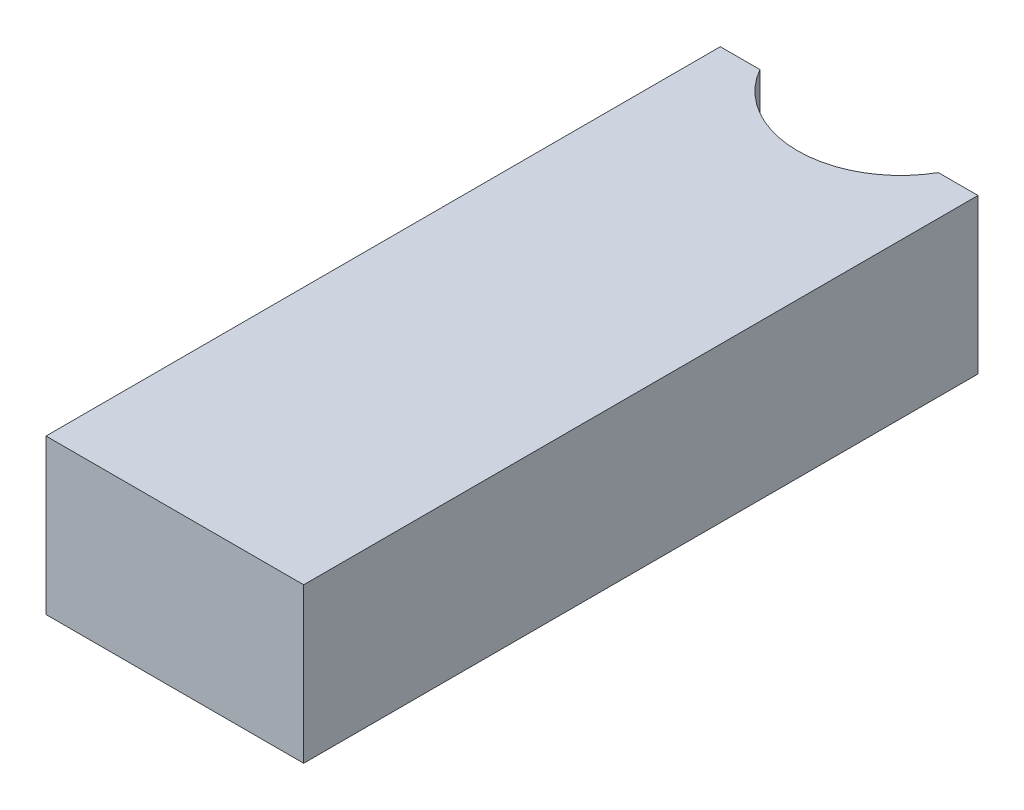
ISO-10303-21;
HEADER;
FILE_DESCRIPTION(('STEP AP214'),'2;1');
FILE_NAME('part.step','',(''),(''),'','','');
FILE_SCHEMA(('AUTOMOTIVE_DESIGN { 1 0 10303 214 1 1 1 1 }'));
ENDSEC;
DATA;
#1=APPLICATION_CONTEXT('core data for automotive mechanical design processes');
#2=APPLICATION_PROTOCOL_DEFINITION('international standard','automotive_design',2000,#1);
#3=PRODUCT_CONTEXT('',#1,'mechanical');
#4=PRODUCT('Part','Part','',(#3));
#5=PRODUCT_RELATED_PRODUCT_CATEGORY('part','',(#4));
#6=PRODUCT_DEFINITION_FORMATION('','',#4);
#7=PRODUCT_DEFINITION_CONTEXT('part definition',#1,'design');
#8=PRODUCT_DEFINITION('design','',#6,#7);
#9=PRODUCT_DEFINITION_SHAPE('','',#8);
#10=(LENGTH_UNIT() NAMED_UNIT(*) SI_UNIT(.MILLI.,.METRE.));
#11=(NAMED_UNIT(*) PLANE_ANGLE_UNIT() SI_UNIT($,.RADIAN.));
#12=(NAMED_UNIT(*) SI_UNIT($,.STERADIAN.) SOLID_ANGLE_UNIT());
#13=UNCERTAINTY_MEASURE_WITH_UNIT(LENGTH_MEASURE(1.E-05),#10,'distance_accuracy_value','');
#14=(GEOMETRIC_REPRESENTATION_CONTEXT(3) GLOBAL_UNCERTAINTY_ASSIGNED_CONTEXT((#13)) GLOBAL_UNIT_ASSIGNED_CONTEXT((#10,
#11,#12)) REPRESENTATION_CONTEXT('',''));
#15=CARTESIAN_POINT('',(0.,0.,0.));
#16=DIRECTION('',(0.,0.,1.));
#17=DIRECTION('',(1.,0.,0.));
#18=AXIS2_PLACEMENT_3D('',#15,#16,#17);
#19=CARTESIAN_POINT('',(0.,0.,0.));
#20=DIRECTION('',(0.,0.,1.));
#21=DIRECTION('',(1.,0.,0.));
#22=AXIS2_PLACEMENT_3D('',#19,#20,#21);
#23=PLANE('',#22);
#24=DIRECTION('',(1.,0.,0.));
#25=VECTOR('',#24,1.);
#26=CARTESIAN_POINT('',(-15.875,-9.525,0.));
#27=LINE('',#26,#25);
#28=CARTESIAN_POINT('',(10.9985226280624,-9.525,0.));
#29=VERTEX_POINT('',#28);
#30=CARTESIAN_POINT('',(15.875,-9.525,0.));
#31=VERTEX_POINT('',#30);
#32=EDGE_CURVE('E85',#29,#31,#27,.T.);
#33=ORIENTED_EDGE('',*,*,#32,.F.);
#34=DIRECTION('',(0.,1.,0.));
#35=VECTOR('',#34,1.);
#36=CARTESIAN_POINT('',(10.9985226280624,-9.525,0.));
#37=LINE('',#36,#35);
#38=CARTESIAN_POINT('',(10.9985226280624,9.525,0.));
#39=VERTEX_POINT('',#38);
#40=EDGE_CURVE('E11',#29,#39,#37,.T.);
#41=ORIENTED_EDGE('',*,*,#40,.T.);
#42=DIRECTION('',(-1.,0.,0.));
#43=VECTOR('',#42,1.);
#44=CARTESIAN_POINT('',(-15.875,9.525,0.));
#45=LINE('',#44,#43);
#46=CARTESIAN_POINT('',(15.875,9.525,0.));
#47=VERTEX_POINT('',#46);
#48=EDGE_CURVE('E108',#47,#39,#45,.T.);
#49=ORIENTED_EDGE('',*,*,#48,.F.);
#50=DIRECTION('',(0.,1.,0.));
#51=VECTOR('',#50,1.);
#52=CARTESIAN_POINT('',(15.875,9.525,0.));
#53=LINE('',#52,#51);
#54=EDGE_CURVE('E117',#31,#47,#53,.T.);
#55=ORIENTED_EDGE('',*,*,#54,.F.);
#56=EDGE_LOOP('',(#33,#41,#49,#55));
#57=FACE_BOUND('',#56,.T.);
#58=ADVANCED_FACE('F41',(#57),#23,.F.);
#59=CARTESIAN_POINT('',(15.875,9.525,83.0834));
#60=DIRECTION('',(-1.,0.,0.));
#61=DIRECTION('',(0.,0.,1.));
#62=AXIS2_PLACEMENT_3D('',#59,#60,#61);
#63=PLANE('',#62);
#64=ORIENTED_EDGE('',*,*,#54,.T.);
#65=DIRECTION('',(0.,0.,-1.));
#66=VECTOR('',#65,1.);
#67=CARTESIAN_POINT('',(15.875,9.525,83.0834));
#68=LINE('',#67,#66);
#69=CARTESIAN_POINT('',(15.875,9.525,83.0834));
#70=VERTEX_POINT('',#69);
#71=EDGE_CURVE('E111',#70,#47,#68,.T.);
#72=ORIENTED_EDGE('',*,*,#71,.F.);
#73=DIRECTION('',(0.,1.,0.));
#74=VECTOR('',#73,1.);
#75=CARTESIAN_POINT('',(15.875,9.525,83.0834));
#76=LINE('',#75,#74);
#77=CARTESIAN_POINT('',(15.875,-9.525,83.0834));
#78=VERTEX_POINT('',#77);
#79=EDGE_CURVE('E124',#78,#70,#76,.T.);
#80=ORIENTED_EDGE('',*,*,#79,.F.);
#81=DIRECTION('',(0.,0.,-1.));
#82=VECTOR('',#81,1.);
#83=CARTESIAN_POINT('',(15.875,-9.525,83.0834));
#84=LINE('',#83,#82);
#85=EDGE_CURVE('E125',#78,#31,#84,.T.);
#86=ORIENTED_EDGE('',*,*,#85,.T.);
#87=EDGE_LOOP('',(#64,#72,#80,#86));
#88=FACE_BOUND('',#87,.T.);
#89=ADVANCED_FACE('F43',(#88),#63,.F.);
#90=CARTESIAN_POINT('',(-15.875,9.525,83.0834));
#91=DIRECTION('',(0.,-1.,0.));
#92=DIRECTION('',(0.,0.,-1.));
#93=AXIS2_PLACEMENT_3D('',#90,#91,#92);
#94=PLANE('',#93);
#95=ORIENTED_EDGE('',*,*,#48,.T.);
#96=CARTESIAN_POINT('',(0.,9.525,-6.35));
#97=DIRECTION('',(0.,1.,0.));
#98=DIRECTION('',(0.,0.,1.));
#99=AXIS2_PLACEMENT_3D('',#96,#97,#98);
#100=CIRCLE('',#99,12.7);
#101=CARTESIAN_POINT('',(-10.9985226280624,9.525,0.));
#102=VERTEX_POINT('',#101);
#103=EDGE_CURVE('E101',#102,#39,#100,.T.);
#104=ORIENTED_EDGE('',*,*,#103,.F.);
#105=CARTESIAN_POINT('',(-15.875,9.525,0.));
#106=VERTEX_POINT('',#105);
#107=EDGE_CURVE('E114',#102,#106,#45,.T.);
#108=ORIENTED_EDGE('',*,*,#107,.T.);
#109=DIRECTION('',(0.,0.,-1.));
#110=VECTOR('',#109,1.);
#111=CARTESIAN_POINT('',(-15.875,9.525,83.0834));
#112=LINE('',#111,#110);
#113=CARTESIAN_POINT('',(-15.875,9.525,83.0834));
#114=VERTEX_POINT('',#113);
#115=EDGE_CURVE('E130',#114,#106,#112,.T.);
#116=ORIENTED_EDGE('',*,*,#115,.F.);
#117=DIRECTION('',(-1.,0.,0.));
#118=VECTOR('',#117,1.);
#119=CARTESIAN_POINT('',(-15.875,9.525,83.0834));
#120=LINE('',#119,#118);
#121=EDGE_CURVE('E93',#70,#114,#120,.T.);
#122=ORIENTED_EDGE('',*,*,#121,.F.);
#123=ORIENTED_EDGE('',*,*,#71,.T.);
#124=EDGE_LOOP('',(#95,#104,#108,#116,#122,#123));
#125=FACE_BOUND('',#124,.T.);
#126=ADVANCED_FACE('F109',(#125),#94,.F.);
#127=CARTESIAN_POINT('',(-15.875,9.525,83.0834));
#128=DIRECTION('',(1.,0.,0.));
#129=DIRECTION('',(0.,0.,-1.));
#130=AXIS2_PLACEMENT_3D('',#127,#128,#129);
#131=PLANE('',#130);
#132=DIRECTION('',(0.,-1.,0.));
#133=VECTOR('',#132,1.);
#134=CARTESIAN_POINT('',(-15.875,9.525,0.));
#135=LINE('',#134,#133);
#136=CARTESIAN_POINT('',(-15.875,-9.525,0.));
#137=VERTEX_POINT('',#136);
#138=EDGE_CURVE('E113',#106,#137,#135,.T.);
#139=ORIENTED_EDGE('',*,*,#138,.T.);
#140=DIRECTION('',(0.,0.,-1.));
#141=VECTOR('',#140,1.);
#142=CARTESIAN_POINT('',(-15.875,-9.525,83.0834));
#143=LINE('',#142,#141);
#144=CARTESIAN_POINT('',(-15.875,-9.525,83.0834));
#145=VERTEX_POINT('',#144);
#146=EDGE_CURVE('E127',#145,#137,#143,.T.);
#147=ORIENTED_EDGE('',*,*,#146,.F.);
#148=DIRECTION('',(0.,-1.,0.));
#149=VECTOR('',#148,1.);
#150=CARTESIAN_POINT('',(-15.875,9.525,83.0834));
#151=LINE('',#150,#149);
#152=EDGE_CURVE('E142',#114,#145,#151,.T.);
#153=ORIENTED_EDGE('',*,*,#152,.F.);
#154=ORIENTED_EDGE('',*,*,#115,.T.);
#155=EDGE_LOOP('',(#139,#147,#153,#154));
#156=FACE_BOUND('',#155,.T.);
#157=ADVANCED_FACE('F141',(#156),#131,.F.);
#158=CARTESIAN_POINT('',(-15.875,-9.525,83.0834));
#159=DIRECTION('',(0.,1.,0.));
#160=DIRECTION('',(0.,0.,1.));
#161=AXIS2_PLACEMENT_3D('',#158,#159,#160);
#162=PLANE('',#161);
#163=CARTESIAN_POINT('',(-10.9985226280624,-9.525,0.));
#164=VERTEX_POINT('',#163);
#165=EDGE_CURVE('E121',#137,#164,#27,.T.);
#166=ORIENTED_EDGE('',*,*,#165,.T.);
#167=CARTESIAN_POINT('',(0.,-9.525,-6.35));
#168=DIRECTION('',(0.,1.,0.));
#169=DIRECTION('',(0.,0.,1.));
#170=AXIS2_PLACEMENT_3D('',#167,#168,#169);
#171=CIRCLE('',#170,12.7);
#172=EDGE_CURVE('E56',#164,#29,#171,.T.);
#173=ORIENTED_EDGE('',*,*,#172,.T.);
#174=ORIENTED_EDGE('',*,*,#32,.T.);
#175=ORIENTED_EDGE('',*,*,#85,.F.);
#176=DIRECTION('',(1.,0.,0.));
#177=VECTOR('',#176,1.);
#178=CARTESIAN_POINT('',(-15.875,-9.525,83.0834));
#179=LINE('',#178,#177);
#180=EDGE_CURVE('E65',#145,#78,#179,.T.);
#181=ORIENTED_EDGE('',*,*,#180,.F.);
#182=ORIENTED_EDGE('',*,*,#146,.T.);
#183=EDGE_LOOP('',(#166,#173,#174,#175,#181,#182));
#184=FACE_BOUND('',#183,.T.);
#185=ADVANCED_FACE('F137',(#184),#162,.F.);
#186=CARTESIAN_POINT('',(0.,0.,83.0834));
#187=DIRECTION('',(0.,0.,1.));
#188=DIRECTION('',(1.,0.,0.));
#189=AXIS2_PLACEMENT_3D('',#186,#187,#188);
#190=PLANE('',#189);
#191=ORIENTED_EDGE('',*,*,#79,.T.);
#192=ORIENTED_EDGE('',*,*,#121,.T.);
#193=ORIENTED_EDGE('',*,*,#152,.T.);
#194=ORIENTED_EDGE('',*,*,#180,.T.);
#195=EDGE_LOOP('',(#191,#192,#193,#194));
#196=FACE_BOUND('',#195,.T.);
#197=ADVANCED_FACE('F149',(#196),#190,.T.);
#198=ORIENTED_EDGE('',*,*,#107,.F.);
#199=DIRECTION('',(0.,1.,0.));
#200=VECTOR('',#199,1.);
#201=CARTESIAN_POINT('',(-10.9985226280624,-9.525,0.));
#202=LINE('',#201,#200);
#203=EDGE_CURVE('E49',#102,#164,#202,.F.);
#204=ORIENTED_EDGE('',*,*,#203,.T.);
#205=ORIENTED_EDGE('',*,*,#165,.F.);
#206=ORIENTED_EDGE('',*,*,#138,.F.);
#207=EDGE_LOOP('',(#198,#204,#205,#206));
#208=FACE_BOUND('',#207,.T.);
#209=ADVANCED_FACE('F135',(#208),#23,.F.);
#210=CARTESIAN_POINT('',(0.,-9.525,-6.35));
#211=DIRECTION('',(0.,1.,0.));
#212=DIRECTION('',(0.,0.,1.));
#213=AXIS2_PLACEMENT_3D('',#210,#211,#212);
#214=CYLINDRICAL_SURFACE('',#213,12.7);
#215=ORIENTED_EDGE('',*,*,#172,.F.);
#216=ORIENTED_EDGE('',*,*,#203,.F.);
#217=ORIENTED_EDGE('',*,*,#103,.T.);
#218=ORIENTED_EDGE('',*,*,#40,.F.);
#219=EDGE_LOOP('',(#215,#216,#217,#218));
#220=FACE_BOUND('',#219,.T.);
#221=ADVANCED_FACE('F102',(#220),#214,.F.);
#222=CLOSED_SHELL('',(#58,#89,#126,#157,#185,#197,#209,#221));
#223=MANIFOLD_SOLID_BREP('B2',#222);
#224=ADVANCED_BREP_SHAPE_REPRESENTATION('',(#18,#223),#14);
#225=SHAPE_DEFINITION_REPRESENTATION(#9,#224);
ENDSEC;
END-ISO-10303-21;
